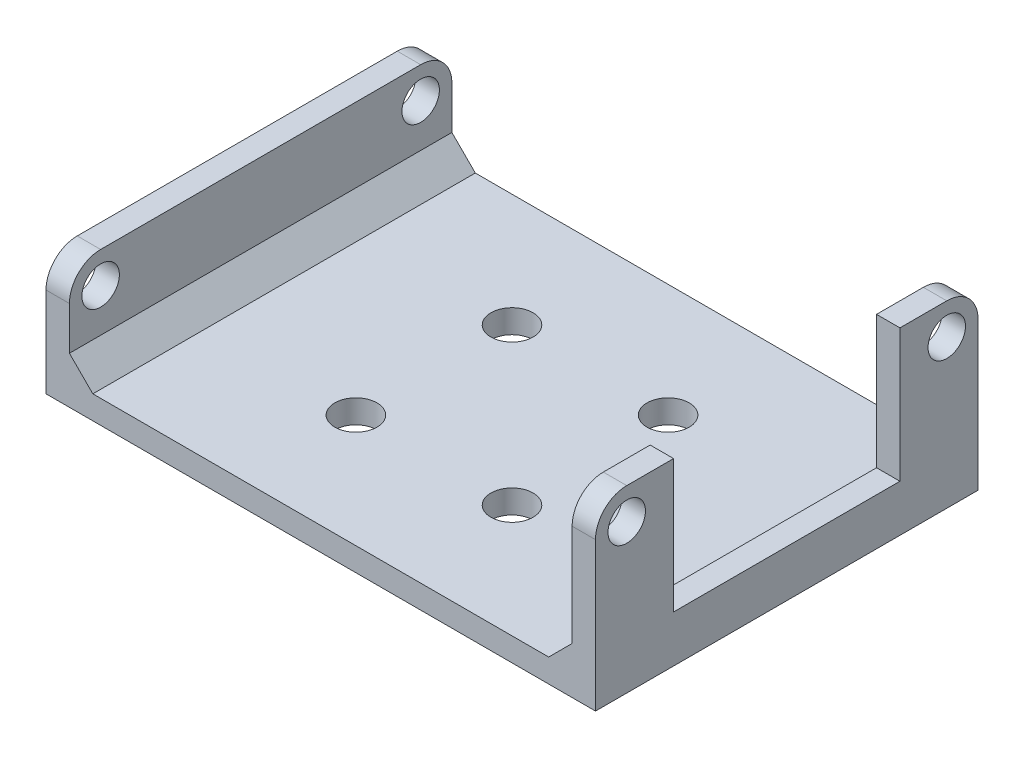
ISO-10303-21;
HEADER;
FILE_DESCRIPTION(('STEP AP214'),'2;1');
FILE_NAME('part.step','',(''),(''),'','','');
FILE_SCHEMA(('AUTOMOTIVE_DESIGN { 1 0 10303 214 1 1 1 1 }'));
ENDSEC;
DATA;
#1=APPLICATION_CONTEXT('core data for automotive mechanical design processes');
#2=APPLICATION_PROTOCOL_DEFINITION('international standard','automotive_design',2000,#1);
#3=PRODUCT_CONTEXT('',#1,'mechanical');
#4=PRODUCT('Part','Part','',(#3));
#5=PRODUCT_RELATED_PRODUCT_CATEGORY('part','',(#4));
#6=PRODUCT_DEFINITION_FORMATION('','',#4);
#7=PRODUCT_DEFINITION_CONTEXT('part definition',#1,'design');
#8=PRODUCT_DEFINITION('design','',#6,#7);
#9=PRODUCT_DEFINITION_SHAPE('','',#8);
#10=(LENGTH_UNIT() NAMED_UNIT(*) SI_UNIT(.MILLI.,.METRE.));
#11=(NAMED_UNIT(*) PLANE_ANGLE_UNIT() SI_UNIT($,.RADIAN.));
#12=(NAMED_UNIT(*) SI_UNIT($,.STERADIAN.) SOLID_ANGLE_UNIT());
#13=UNCERTAINTY_MEASURE_WITH_UNIT(LENGTH_MEASURE(1.E-05),#10,'distance_accuracy_value','');
#14=(GEOMETRIC_REPRESENTATION_CONTEXT(3) GLOBAL_UNCERTAINTY_ASSIGNED_CONTEXT((#13)) GLOBAL_UNIT_ASSIGNED_CONTEXT((#10,
#11,#12)) REPRESENTATION_CONTEXT('',''));
#15=CARTESIAN_POINT('',(0.,0.,0.));
#16=DIRECTION('',(0.,0.,1.));
#17=DIRECTION('',(1.,0.,0.));
#18=AXIS2_PLACEMENT_3D('',#15,#16,#17);
#19=CARTESIAN_POINT('',(16.1,0.,0.));
#20=DIRECTION('',(1.,0.,0.));
#21=DIRECTION('',(0.,0.,-1.));
#22=AXIS2_PLACEMENT_3D('',#19,#20,#21);
#23=PLANE('',#22);
#24=CARTESIAN_POINT('',(16.1,9.51,-10.25));
#25=DIRECTION('',(1.,0.,0.));
#26=DIRECTION('',(0.,0.,-1.));
#27=AXIS2_PLACEMENT_3D('',#24,#25,#26);
#28=CIRCLE('',#27,1.2);
#29=CARTESIAN_POINT('',(16.1,9.51,-11.45));
#30=VERTEX_POINT('',#29);
#31=EDGE_CURVE('E239',#30,#30,#28,.F.);
#32=ORIENTED_EDGE('',*,*,#31,.F.);
#33=EDGE_LOOP('',(#32));
#34=FACE_BOUND('',#33,.T.);
#35=DIRECTION('',(0.,-1.,0.));
#36=VECTOR('',#35,1.);
#37=CARTESIAN_POINT('',(16.1,0.,-12.25));
#38=LINE('',#37,#36);
#39=CARTESIAN_POINT('',(16.1,9.51,-12.25));
#40=VERTEX_POINT('',#39);
#41=CARTESIAN_POINT('',(16.1,3.,-12.25));
#42=VERTEX_POINT('',#41);
#43=EDGE_CURVE('E221',#40,#42,#38,.T.);
#44=ORIENTED_EDGE('',*,*,#43,.T.);
#45=DIRECTION('',(0.,0.,1.));
#46=VECTOR('',#45,1.);
#47=CARTESIAN_POINT('',(16.1,3.,0.));
#48=LINE('',#47,#46);
#49=CARTESIAN_POINT('',(16.1,3.,-7.25));
#50=VERTEX_POINT('',#49);
#51=EDGE_CURVE('E345',#42,#50,#48,.T.);
#52=ORIENTED_EDGE('',*,*,#51,.T.);
#53=DIRECTION('',(0.,1.,0.));
#54=VECTOR('',#53,1.);
#55=CARTESIAN_POINT('',(16.1,0.,-7.25));
#56=LINE('',#55,#54);
#57=CARTESIAN_POINT('',(16.1,11.51,-7.25));
#58=VERTEX_POINT('',#57);
#59=EDGE_CURVE('E230',#50,#58,#56,.T.);
#60=ORIENTED_EDGE('',*,*,#59,.T.);
#61=DIRECTION('',(0.,0.,-1.));
#62=VECTOR('',#61,1.);
#63=CARTESIAN_POINT('',(16.1,11.51,0.));
#64=LINE('',#63,#62);
#65=CARTESIAN_POINT('',(16.1,11.51,-10.25));
#66=VERTEX_POINT('',#65);
#67=EDGE_CURVE('E227',#58,#66,#64,.T.);
#68=ORIENTED_EDGE('',*,*,#67,.T.);
#69=CARTESIAN_POINT('',(16.1,9.51,-10.25));
#70=DIRECTION('',(1.,0.,0.));
#71=DIRECTION('',(0.,0.,-1.));
#72=AXIS2_PLACEMENT_3D('',#69,#70,#71);
#73=CIRCLE('',#72,2.);
#74=EDGE_CURVE('E224',#66,#40,#73,.F.);
#75=ORIENTED_EDGE('',*,*,#74,.T.);
#76=EDGE_LOOP('',(#44,#52,#60,#68,#75));
#77=FACE_BOUND('',#76,.T.);
#78=ADVANCED_FACE('F40',(#34,#77),#23,.F.);
#79=CARTESIAN_POINT('',(0.,1.5,0.));
#80=DIRECTION('',(0.,1.,0.));
#81=DIRECTION('',(0.,0.,1.));
#82=AXIS2_PLACEMENT_3D('',#79,#80,#81);
#83=PLANE('',#82);
#84=DIRECTION('',(1.,0.,0.));
#85=VECTOR('',#84,1.);
#86=CARTESIAN_POINT('',(17.6,1.5,12.25));
#87=LINE('',#86,#85);
#88=CARTESIAN_POINT('',(-14.6,1.5,12.25));
#89=VERTEX_POINT('',#88);
#90=CARTESIAN_POINT('',(14.6,1.5,12.25));
#91=VERTEX_POINT('',#90);
#92=EDGE_CURVE('E313',#89,#91,#87,.T.);
#93=ORIENTED_EDGE('',*,*,#92,.T.);
#94=DIRECTION('',(0.,0.,-1.));
#95=VECTOR('',#94,1.);
#96=CARTESIAN_POINT('',(14.6,1.5,0.));
#97=LINE('',#96,#95);
#98=CARTESIAN_POINT('',(14.6,1.5,-12.25));
#99=VERTEX_POINT('',#98);
#100=EDGE_CURVE('E340',#91,#99,#97,.T.);
#101=ORIENTED_EDGE('',*,*,#100,.T.);
#102=DIRECTION('',(-1.,0.,0.));
#103=VECTOR('',#102,1.);
#104=CARTESIAN_POINT('',(17.6,1.5,-12.25));
#105=LINE('',#104,#103);
#106=CARTESIAN_POINT('',(-14.6,1.5,-12.25));
#107=VERTEX_POINT('',#106);
#108=EDGE_CURVE('E316',#99,#107,#105,.T.);
#109=ORIENTED_EDGE('',*,*,#108,.T.);
#110=DIRECTION('',(0.,0.,1.));
#111=VECTOR('',#110,1.);
#112=CARTESIAN_POINT('',(-14.6,1.5,12.25));
#113=LINE('',#112,#111);
#114=EDGE_CURVE('E338',#107,#89,#113,.T.);
#115=ORIENTED_EDGE('',*,*,#114,.T.);
#116=EDGE_LOOP('',(#93,#101,#109,#115));
#117=FACE_BOUND('',#116,.T.);
#118=CARTESIAN_POINT('',(-5.,1.5,5.));
#119=DIRECTION('',(0.,1.,0.));
#120=DIRECTION('',(0.,0.,-1.));
#121=AXIS2_PLACEMENT_3D('',#118,#119,#120);
#122=CIRCLE('',#121,1.35);
#123=CARTESIAN_POINT('',(-5.,1.5,3.65));
#124=VERTEX_POINT('',#123);
#125=EDGE_CURVE('E295',#124,#124,#122,.T.);
#126=ORIENTED_EDGE('',*,*,#125,.F.);
#127=EDGE_LOOP('',(#126));
#128=FACE_BOUND('',#127,.T.);
#129=CARTESIAN_POINT('',(-5.,1.5,-5.));
#130=DIRECTION('',(0.,1.,0.));
#131=DIRECTION('',(0.,0.,1.));
#132=AXIS2_PLACEMENT_3D('',#129,#130,#131);
#133=CIRCLE('',#132,1.35);
#134=CARTESIAN_POINT('',(-5.,1.5,-3.65));
#135=VERTEX_POINT('',#134);
#136=EDGE_CURVE('E307',#135,#135,#133,.T.);
#137=ORIENTED_EDGE('',*,*,#136,.F.);
#138=EDGE_LOOP('',(#137));
#139=FACE_BOUND('',#138,.T.);
#140=CARTESIAN_POINT('',(5.,1.5,-5.));
#141=DIRECTION('',(0.,1.,0.));
#142=DIRECTION('',(0.,0.,-1.));
#143=AXIS2_PLACEMENT_3D('',#140,#141,#142);
#144=CIRCLE('',#143,1.35);
#145=CARTESIAN_POINT('',(5.,1.5,-6.35));
#146=VERTEX_POINT('',#145);
#147=EDGE_CURVE('E301',#146,#146,#144,.T.);
#148=ORIENTED_EDGE('',*,*,#147,.F.);
#149=EDGE_LOOP('',(#148));
#150=FACE_BOUND('',#149,.T.);
#151=CARTESIAN_POINT('',(5.,1.5,5.));
#152=DIRECTION('',(0.,1.,0.));
#153=DIRECTION('',(0.,0.,1.));
#154=AXIS2_PLACEMENT_3D('',#151,#152,#153);
#155=CIRCLE('',#154,1.35);
#156=CARTESIAN_POINT('',(5.,1.5,6.35));
#157=VERTEX_POINT('',#156);
#158=EDGE_CURVE('E289',#157,#157,#155,.T.);
#159=ORIENTED_EDGE('',*,*,#158,.F.);
#160=EDGE_LOOP('',(#159));
#161=FACE_BOUND('',#160,.T.);
#162=ADVANCED_FACE('F358',(#117,#128,#139,#150,#161),#83,.T.);
#163=CARTESIAN_POINT('',(0.,0.,0.));
#164=DIRECTION('',(0.,1.,0.));
#165=DIRECTION('',(0.,0.,1.));
#166=AXIS2_PLACEMENT_3D('',#163,#164,#165);
#167=PLANE('',#166);
#168=DIRECTION('',(0.,0.,-1.));
#169=VECTOR('',#168,1.);
#170=CARTESIAN_POINT('',(17.6,0.,12.25));
#171=LINE('',#170,#169);
#172=CARTESIAN_POINT('',(17.6,0.,12.25));
#173=VERTEX_POINT('',#172);
#174=CARTESIAN_POINT('',(17.6,0.,-12.25));
#175=VERTEX_POINT('',#174);
#176=EDGE_CURVE('E325',#173,#175,#171,.T.);
#177=ORIENTED_EDGE('',*,*,#176,.F.);
#178=DIRECTION('',(1.,0.,0.));
#179=VECTOR('',#178,1.);
#180=CARTESIAN_POINT('',(17.6,0.,12.25));
#181=LINE('',#180,#179);
#182=CARTESIAN_POINT('',(-17.6,0.,12.25));
#183=VERTEX_POINT('',#182);
#184=EDGE_CURVE('E323',#183,#173,#181,.T.);
#185=ORIENTED_EDGE('',*,*,#184,.F.);
#186=DIRECTION('',(0.,0.,1.));
#187=VECTOR('',#186,1.);
#188=CARTESIAN_POINT('',(-17.6,0.,12.25));
#189=LINE('',#188,#187);
#190=CARTESIAN_POINT('',(-17.6,0.,-12.25));
#191=VERTEX_POINT('',#190);
#192=EDGE_CURVE('E310',#191,#183,#189,.T.);
#193=ORIENTED_EDGE('',*,*,#192,.F.);
#194=DIRECTION('',(-1.,0.,0.));
#195=VECTOR('',#194,1.);
#196=CARTESIAN_POINT('',(17.6,0.,-12.25));
#197=LINE('',#196,#195);
#198=EDGE_CURVE('E317',#175,#191,#197,.T.);
#199=ORIENTED_EDGE('',*,*,#198,.F.);
#200=EDGE_LOOP('',(#177,#185,#193,#199));
#201=FACE_BOUND('',#200,.T.);
#202=CARTESIAN_POINT('',(5.,0.,5.));
#203=DIRECTION('',(0.,1.,0.));
#204=DIRECTION('',(0.,0.,1.));
#205=AXIS2_PLACEMENT_3D('',#202,#203,#204);
#206=CIRCLE('',#205,1.35);
#207=CARTESIAN_POINT('',(5.,0.,6.35));
#208=VERTEX_POINT('',#207);
#209=EDGE_CURVE('E270',#208,#208,#206,.T.);
#210=ORIENTED_EDGE('',*,*,#209,.T.);
#211=EDGE_LOOP('',(#210));
#212=FACE_BOUND('',#211,.T.);
#213=CARTESIAN_POINT('',(-5.,0.,5.));
#214=DIRECTION('',(0.,1.,0.));
#215=DIRECTION('',(0.,0.,-1.));
#216=AXIS2_PLACEMENT_3D('',#213,#214,#215);
#217=CIRCLE('',#216,1.35);
#218=CARTESIAN_POINT('',(-5.,0.,3.65));
#219=VERTEX_POINT('',#218);
#220=EDGE_CURVE('E292',#219,#219,#217,.T.);
#221=ORIENTED_EDGE('',*,*,#220,.T.);
#222=EDGE_LOOP('',(#221));
#223=FACE_BOUND('',#222,.T.);
#224=CARTESIAN_POINT('',(5.,0.,-5.));
#225=DIRECTION('',(0.,1.,0.));
#226=DIRECTION('',(0.,0.,-1.));
#227=AXIS2_PLACEMENT_3D('',#224,#225,#226);
#228=CIRCLE('',#227,1.35);
#229=CARTESIAN_POINT('',(5.,0.,-6.35));
#230=VERTEX_POINT('',#229);
#231=EDGE_CURVE('E298',#230,#230,#228,.T.);
#232=ORIENTED_EDGE('',*,*,#231,.T.);
#233=EDGE_LOOP('',(#232));
#234=FACE_BOUND('',#233,.T.);
#235=CARTESIAN_POINT('',(-5.,0.,-5.));
#236=DIRECTION('',(0.,1.,0.));
#237=DIRECTION('',(0.,0.,1.));
#238=AXIS2_PLACEMENT_3D('',#235,#236,#237);
#239=CIRCLE('',#238,1.35);
#240=CARTESIAN_POINT('',(-5.,0.,-3.65));
#241=VERTEX_POINT('',#240);
#242=EDGE_CURVE('E304',#241,#241,#239,.T.);
#243=ORIENTED_EDGE('',*,*,#242,.T.);
#244=EDGE_LOOP('',(#243));
#245=FACE_BOUND('',#244,.T.);
#246=ADVANCED_FACE('F378',(#201,#212,#223,#234,#245),#167,.F.);
#247=CARTESIAN_POINT('',(-17.6,1.5,12.25));
#248=DIRECTION('',(1.,0.,0.));
#249=DIRECTION('',(0.,0.,-1.));
#250=AXIS2_PLACEMENT_3D('',#247,#248,#249);
#251=PLANE('',#250);
#252=ORIENTED_EDGE('',*,*,#192,.T.);
#253=DIRECTION('',(0.,-1.,0.));
#254=VECTOR('',#253,1.);
#255=CARTESIAN_POINT('',(-17.6,1.5,12.25));
#256=LINE('',#255,#254);
#257=CARTESIAN_POINT('',(-17.6,5.76,12.25));
#258=VERTEX_POINT('',#257);
#259=EDGE_CURVE('E336',#258,#183,#256,.T.);
#260=ORIENTED_EDGE('',*,*,#259,.F.);
#261=CARTESIAN_POINT('',(-17.6,5.76,10.25));
#262=DIRECTION('',(-1.,0.,0.));
#263=DIRECTION('',(0.,0.,-1.));
#264=AXIS2_PLACEMENT_3D('',#261,#262,#263);
#265=CIRCLE('',#264,2.);
#266=CARTESIAN_POINT('',(-17.6,7.76,10.25));
#267=VERTEX_POINT('',#266);
#268=EDGE_CURVE('E178',#258,#267,#265,.T.);
#269=ORIENTED_EDGE('',*,*,#268,.T.);
#270=DIRECTION('',(0.,0.,-1.));
#271=VECTOR('',#270,1.);
#272=CARTESIAN_POINT('',(-17.6,7.76,10.25));
#273=LINE('',#272,#271);
#274=CARTESIAN_POINT('',(-17.6,7.76,-10.25));
#275=VERTEX_POINT('',#274);
#276=EDGE_CURVE('E194',#267,#275,#273,.T.);
#277=ORIENTED_EDGE('',*,*,#276,.T.);
#278=CARTESIAN_POINT('',(-17.6,5.76,-10.25));
#279=DIRECTION('',(-1.,0.,0.));
#280=DIRECTION('',(0.,0.,1.));
#281=AXIS2_PLACEMENT_3D('',#278,#279,#280);
#282=CIRCLE('',#281,2.);
#283=CARTESIAN_POINT('',(-17.6,5.76,-12.25));
#284=VERTEX_POINT('',#283);
#285=EDGE_CURVE('E198',#275,#284,#282,.T.);
#286=ORIENTED_EDGE('',*,*,#285,.T.);
#287=DIRECTION('',(0.,-1.,0.));
#288=VECTOR('',#287,1.);
#289=CARTESIAN_POINT('',(-17.6,1.5,-12.25));
#290=LINE('',#289,#288);
#291=EDGE_CURVE('E320',#284,#191,#290,.T.);
#292=ORIENTED_EDGE('',*,*,#291,.T.);
#293=EDGE_LOOP('',(#252,#260,#269,#277,#286,#292));
#294=FACE_BOUND('',#293,.T.);
#295=CARTESIAN_POINT('',(-17.6,5.76,10.25));
#296=DIRECTION('',(-1.,0.,0.));
#297=DIRECTION('',(0.,0.,-1.));
#298=AXIS2_PLACEMENT_3D('',#295,#296,#297);
#299=CIRCLE('',#298,1.2);
#300=CARTESIAN_POINT('',(-17.6,5.76,9.05));
#301=VERTEX_POINT('',#300);
#302=EDGE_CURVE('E769',#301,#301,#299,.T.);
#303=ORIENTED_EDGE('',*,*,#302,.F.);
#304=EDGE_LOOP('',(#303));
#305=FACE_BOUND('',#304,.T.);
#306=CARTESIAN_POINT('',(-17.6,5.76,-10.25));
#307=DIRECTION('',(-1.,0.,0.));
#308=DIRECTION('',(0.,0.,1.));
#309=AXIS2_PLACEMENT_3D('',#306,#307,#308);
#310=CIRCLE('',#309,1.2);
#311=CARTESIAN_POINT('',(-17.6,5.76,-9.05));
#312=VERTEX_POINT('',#311);
#313=EDGE_CURVE('E764',#312,#312,#310,.T.);
#314=ORIENTED_EDGE('',*,*,#313,.F.);
#315=EDGE_LOOP('',(#314));
#316=FACE_BOUND('',#315,.T.);
#317=ADVANCED_FACE('F368',(#294,#305,#316),#251,.F.);
#318=CARTESIAN_POINT('',(17.6,1.5,12.25));
#319=DIRECTION('',(0.,0.,-1.));
#320=DIRECTION('',(-1.,0.,0.));
#321=AXIS2_PLACEMENT_3D('',#318,#319,#320);
#322=PLANE('',#321);
#323=ORIENTED_EDGE('',*,*,#92,.F.);
#324=DIRECTION('',(0.707106781186544,-0.707106781186551,0.));
#325=VECTOR('',#324,1.);
#326=CARTESIAN_POINT('',(1.49999999999985,-14.6,12.25));
#327=LINE('',#326,#325);
#328=CARTESIAN_POINT('',(-16.1,3.00000000000001,12.25));
#329=VERTEX_POINT('',#328);
#330=EDGE_CURVE('E11',#89,#329,#327,.F.);
#331=ORIENTED_EDGE('',*,*,#330,.T.);
#332=DIRECTION('',(0.,1.,0.));
#333=VECTOR('',#332,1.);
#334=CARTESIAN_POINT('',(-16.1,5.76,12.25));
#335=LINE('',#334,#333);
#336=CARTESIAN_POINT('',(-16.1,5.76,12.25));
#337=VERTEX_POINT('',#336);
#338=EDGE_CURVE('E163',#329,#337,#335,.T.);
#339=ORIENTED_EDGE('',*,*,#338,.T.);
#340=DIRECTION('',(-1.,0.,0.));
#341=VECTOR('',#340,1.);
#342=CARTESIAN_POINT('',(-16.1,5.76,12.25));
#343=LINE('',#342,#341);
#344=EDGE_CURVE('E167',#337,#258,#343,.T.);
#345=ORIENTED_EDGE('',*,*,#344,.T.);
#346=ORIENTED_EDGE('',*,*,#259,.T.);
#347=ORIENTED_EDGE('',*,*,#184,.T.);
#348=DIRECTION('',(0.,-1.,0.));
#349=VECTOR('',#348,1.);
#350=CARTESIAN_POINT('',(17.6,1.5,12.25));
#351=LINE('',#350,#349);
#352=CARTESIAN_POINT('',(17.6,9.51,12.25));
#353=VERTEX_POINT('',#352);
#354=EDGE_CURVE('E333',#353,#173,#351,.T.);
#355=ORIENTED_EDGE('',*,*,#354,.F.);
#356=DIRECTION('',(1.,0.,0.));
#357=VECTOR('',#356,1.);
#358=CARTESIAN_POINT('',(16.1,9.51,12.25));
#359=LINE('',#358,#357);
#360=CARTESIAN_POINT('',(16.1,9.51,12.25));
#361=VERTEX_POINT('',#360);
#362=EDGE_CURVE('E285',#361,#353,#359,.T.);
#363=ORIENTED_EDGE('',*,*,#362,.F.);
#364=DIRECTION('',(0.,-1.,0.));
#365=VECTOR('',#364,1.);
#366=CARTESIAN_POINT('',(16.1,0.,12.25));
#367=LINE('',#366,#365);
#368=CARTESIAN_POINT('',(16.1,3.,12.25));
#369=VERTEX_POINT('',#368);
#370=EDGE_CURVE('E218',#361,#369,#367,.T.);
#371=ORIENTED_EDGE('',*,*,#370,.T.);
#372=DIRECTION('',(-0.707106781186551,-0.707106781186544,0.));
#373=VECTOR('',#372,1.);
#374=CARTESIAN_POINT('',(16.1,3.00000000000001,12.25));
#375=LINE('',#374,#373);
#376=EDGE_CURVE('E351',#369,#91,#375,.T.);
#377=ORIENTED_EDGE('',*,*,#376,.T.);
#378=EDGE_LOOP('',(#323,#331,#339,#345,#346,#347,#355,#363,#371,#377));
#379=FACE_BOUND('',#378,.T.);
#380=ADVANCED_FACE('F165',(#379),#322,.F.);
#381=CARTESIAN_POINT('',(17.6,1.5,12.25));
#382=DIRECTION('',(-1.,0.,0.));
#383=DIRECTION('',(0.,0.,1.));
#384=AXIS2_PLACEMENT_3D('',#381,#382,#383);
#385=PLANE('',#384);
#386=ORIENTED_EDGE('',*,*,#176,.T.);
#387=DIRECTION('',(0.,-1.,0.));
#388=VECTOR('',#387,1.);
#389=CARTESIAN_POINT('',(17.6,1.5,-12.25));
#390=LINE('',#389,#388);
#391=CARTESIAN_POINT('',(17.6,9.51,-12.25));
#392=VERTEX_POINT('',#391);
#393=EDGE_CURVE('E330',#392,#175,#390,.T.);
#394=ORIENTED_EDGE('',*,*,#393,.F.);
#395=CARTESIAN_POINT('',(17.6,9.51,-10.25));
#396=DIRECTION('',(1.,0.,0.));
#397=DIRECTION('',(0.,0.,-1.));
#398=AXIS2_PLACEMENT_3D('',#395,#396,#397);
#399=CIRCLE('',#398,2.);
#400=CARTESIAN_POINT('',(17.6,11.51,-10.25));
#401=VERTEX_POINT('',#400);
#402=EDGE_CURVE('E251',#401,#392,#399,.F.);
#403=ORIENTED_EDGE('',*,*,#402,.F.);
#404=DIRECTION('',(0.,0.,-1.));
#405=VECTOR('',#404,1.);
#406=CARTESIAN_POINT('',(17.6,11.51,0.));
#407=LINE('',#406,#405);
#408=CARTESIAN_POINT('',(17.6,11.51,-7.25));
#409=VERTEX_POINT('',#408);
#410=EDGE_CURVE('E254',#409,#401,#407,.T.);
#411=ORIENTED_EDGE('',*,*,#410,.F.);
#412=DIRECTION('',(0.,1.,0.));
#413=VECTOR('',#412,1.);
#414=CARTESIAN_POINT('',(17.6,0.,-7.25));
#415=LINE('',#414,#413);
#416=CARTESIAN_POINT('',(17.6,3.,-7.25));
#417=VERTEX_POINT('',#416);
#418=EDGE_CURVE('E257',#417,#409,#415,.T.);
#419=ORIENTED_EDGE('',*,*,#418,.F.);
#420=DIRECTION('',(0.,0.,-1.));
#421=VECTOR('',#420,1.);
#422=CARTESIAN_POINT('',(17.6,3.,0.));
#423=LINE('',#422,#421);
#424=CARTESIAN_POINT('',(17.6,3.,7.25));
#425=VERTEX_POINT('',#424);
#426=EDGE_CURVE('E260',#425,#417,#423,.T.);
#427=ORIENTED_EDGE('',*,*,#426,.F.);
#428=DIRECTION('',(0.,1.,0.));
#429=VECTOR('',#428,1.);
#430=CARTESIAN_POINT('',(17.6,0.,7.25));
#431=LINE('',#430,#429);
#432=CARTESIAN_POINT('',(17.6,11.51,7.25));
#433=VERTEX_POINT('',#432);
#434=EDGE_CURVE('E263',#425,#433,#431,.T.);
#435=ORIENTED_EDGE('',*,*,#434,.T.);
#436=DIRECTION('',(0.,0.,1.));
#437=VECTOR('',#436,1.);
#438=CARTESIAN_POINT('',(17.6,11.51,0.));
#439=LINE('',#438,#437);
#440=CARTESIAN_POINT('',(17.6,11.51,10.25));
#441=VERTEX_POINT('',#440);
#442=EDGE_CURVE('E245',#433,#441,#439,.T.);
#443=ORIENTED_EDGE('',*,*,#442,.T.);
#444=CARTESIAN_POINT('',(17.6,9.51,10.25));
#445=DIRECTION('',(1.,0.,0.));
#446=DIRECTION('',(0.,0.,-1.));
#447=AXIS2_PLACEMENT_3D('',#444,#445,#446);
#448=CIRCLE('',#447,2.);
#449=EDGE_CURVE('E248',#441,#353,#448,.T.);
#450=ORIENTED_EDGE('',*,*,#449,.T.);
#451=ORIENTED_EDGE('',*,*,#354,.T.);
#452=EDGE_LOOP('',(#386,#394,#403,#411,#419,#427,#435,#443,#450,#451));
#453=FACE_BOUND('',#452,.T.);
#454=CARTESIAN_POINT('',(17.6,9.51,10.25));
#455=DIRECTION('',(1.,0.,0.));
#456=DIRECTION('',(0.,0.,-1.));
#457=AXIS2_PLACEMENT_3D('',#454,#455,#456);
#458=CIRCLE('',#457,1.2);
#459=CARTESIAN_POINT('',(17.6,9.51,9.05));
#460=VERTEX_POINT('',#459);
#461=EDGE_CURVE('E204',#460,#460,#458,.T.);
#462=ORIENTED_EDGE('',*,*,#461,.F.);
#463=EDGE_LOOP('',(#462));
#464=FACE_BOUND('',#463,.T.);
#465=CARTESIAN_POINT('',(17.6,9.51,-10.25));
#466=DIRECTION('',(1.,0.,0.));
#467=DIRECTION('',(0.,0.,-1.));
#468=AXIS2_PLACEMENT_3D('',#465,#466,#467);
#469=CIRCLE('',#468,1.2);
#470=CARTESIAN_POINT('',(17.6,9.51,-11.45));
#471=VERTEX_POINT('',#470);
#472=EDGE_CURVE('E212',#471,#471,#469,.F.);
#473=ORIENTED_EDGE('',*,*,#472,.T.);
#474=EDGE_LOOP('',(#473));
#475=FACE_BOUND('',#474,.T.);
#476=ADVANCED_FACE('F374',(#453,#464,#475),#385,.F.);
#477=CARTESIAN_POINT('',(17.6,1.5,-12.25));
#478=DIRECTION('',(0.,0.,1.));
#479=DIRECTION('',(1.,0.,0.));
#480=AXIS2_PLACEMENT_3D('',#477,#478,#479);
#481=PLANE('',#480);
#482=ORIENTED_EDGE('',*,*,#198,.T.);
#483=ORIENTED_EDGE('',*,*,#291,.F.);
#484=DIRECTION('',(-1.,0.,0.));
#485=VECTOR('',#484,1.);
#486=CARTESIAN_POINT('',(-16.1,5.76,-12.25));
#487=LINE('',#486,#485);
#488=CARTESIAN_POINT('',(-16.1,5.76,-12.25));
#489=VERTEX_POINT('',#488);
#490=EDGE_CURVE('E201',#489,#284,#487,.T.);
#491=ORIENTED_EDGE('',*,*,#490,.F.);
#492=DIRECTION('',(0.,-1.,0.));
#493=VECTOR('',#492,1.);
#494=CARTESIAN_POINT('',(-16.1,5.76,-12.25));
#495=LINE('',#494,#493);
#496=CARTESIAN_POINT('',(-16.1,3.00000000000001,-12.25));
#497=VERTEX_POINT('',#496);
#498=EDGE_CURVE('E172',#489,#497,#495,.T.);
#499=ORIENTED_EDGE('',*,*,#498,.T.);
#500=DIRECTION('',(-0.707106781186544,0.707106781186551,0.));
#501=VECTOR('',#500,1.);
#502=CARTESIAN_POINT('',(1.49999999999985,-14.6,-12.25));
#503=LINE('',#502,#501);
#504=EDGE_CURVE('E49',#497,#107,#503,.F.);
#505=ORIENTED_EDGE('',*,*,#504,.T.);
#506=ORIENTED_EDGE('',*,*,#108,.F.);
#507=DIRECTION('',(0.707106781186551,0.707106781186544,0.));
#508=VECTOR('',#507,1.);
#509=CARTESIAN_POINT('',(16.1,3.00000000000001,-12.25));
#510=LINE('',#509,#508);
#511=EDGE_CURVE('E349',#99,#42,#510,.T.);
#512=ORIENTED_EDGE('',*,*,#511,.T.);
#513=ORIENTED_EDGE('',*,*,#43,.F.);
#514=DIRECTION('',(1.,0.,0.));
#515=VECTOR('',#514,1.);
#516=CARTESIAN_POINT('',(16.1,9.51,-12.25));
#517=LINE('',#516,#515);
#518=EDGE_CURVE('E282',#40,#392,#517,.T.);
#519=ORIENTED_EDGE('',*,*,#518,.T.);
#520=ORIENTED_EDGE('',*,*,#393,.T.);
#521=EDGE_LOOP('',(#482,#483,#491,#499,#505,#506,#512,#513,#519,#520));
#522=FACE_BOUND('',#521,.T.);
#523=ADVANCED_FACE('F355',(#522),#481,.F.);
#524=CARTESIAN_POINT('',(-5.,1.5,-5.));
#525=DIRECTION('',(0.,-1.,0.));
#526=DIRECTION('',(0.,0.,-1.));
#527=AXIS2_PLACEMENT_3D('',#524,#525,#526);
#528=CYLINDRICAL_SURFACE('',#527,1.35);
#529=ORIENTED_EDGE('',*,*,#136,.T.);
#530=EDGE_LOOP('',(#529));
#531=FACE_BOUND('',#530,.T.);
#532=ORIENTED_EDGE('',*,*,#242,.F.);
#533=EDGE_LOOP('',(#532));
#534=FACE_BOUND('',#533,.T.);
#535=ADVANCED_FACE('F461',(#531,#534),#528,.F.);
#536=CARTESIAN_POINT('',(5.,1.5,-5.));
#537=DIRECTION('',(0.,-1.,0.));
#538=DIRECTION('',(0.,0.,-1.));
#539=AXIS2_PLACEMENT_3D('',#536,#537,#538);
#540=CYLINDRICAL_SURFACE('',#539,1.35);
#541=ORIENTED_EDGE('',*,*,#147,.T.);
#542=EDGE_LOOP('',(#541));
#543=FACE_BOUND('',#542,.T.);
#544=ORIENTED_EDGE('',*,*,#231,.F.);
#545=EDGE_LOOP('',(#544));
#546=FACE_BOUND('',#545,.T.);
#547=ADVANCED_FACE('F632',(#543,#546),#540,.F.);
#548=CARTESIAN_POINT('',(-5.,1.5,5.));
#549=DIRECTION('',(0.,-1.,0.));
#550=DIRECTION('',(0.,0.,-1.));
#551=AXIS2_PLACEMENT_3D('',#548,#549,#550);
#552=CYLINDRICAL_SURFACE('',#551,1.35);
#553=ORIENTED_EDGE('',*,*,#125,.T.);
#554=EDGE_LOOP('',(#553));
#555=FACE_BOUND('',#554,.T.);
#556=ORIENTED_EDGE('',*,*,#220,.F.);
#557=EDGE_LOOP('',(#556));
#558=FACE_BOUND('',#557,.T.);
#559=ADVANCED_FACE('F623',(#555,#558),#552,.F.);
#560=CARTESIAN_POINT('',(5.,1.5,5.));
#561=DIRECTION('',(0.,-1.,0.));
#562=DIRECTION('',(0.,0.,-1.));
#563=AXIS2_PLACEMENT_3D('',#560,#561,#562);
#564=CYLINDRICAL_SURFACE('',#563,1.35);
#565=ORIENTED_EDGE('',*,*,#158,.T.);
#566=EDGE_LOOP('',(#565));
#567=FACE_BOUND('',#566,.T.);
#568=ORIENTED_EDGE('',*,*,#209,.F.);
#569=EDGE_LOOP('',(#568));
#570=FACE_BOUND('',#569,.T.);
#571=ADVANCED_FACE('F608',(#567,#570),#564,.F.);
#572=CARTESIAN_POINT('',(16.1,11.51,0.));
#573=DIRECTION('',(0.,1.,0.));
#574=DIRECTION('',(0.,0.,1.));
#575=AXIS2_PLACEMENT_3D('',#572,#573,#574);
#576=PLANE('',#575);
#577=ORIENTED_EDGE('',*,*,#442,.F.);
#578=DIRECTION('',(1.,0.,0.));
#579=VECTOR('',#578,1.);
#580=CARTESIAN_POINT('',(16.1,11.51,7.25));
#581=LINE('',#580,#579);
#582=CARTESIAN_POINT('',(16.1,11.51,7.25));
#583=VERTEX_POINT('',#582);
#584=EDGE_CURVE('E268',#583,#433,#581,.T.);
#585=ORIENTED_EDGE('',*,*,#584,.F.);
#586=DIRECTION('',(0.,0.,1.));
#587=VECTOR('',#586,1.);
#588=CARTESIAN_POINT('',(16.1,11.51,0.));
#589=LINE('',#588,#587);
#590=CARTESIAN_POINT('',(16.1,11.51,10.25));
#591=VERTEX_POINT('',#590);
#592=EDGE_CURVE('E211',#583,#591,#589,.T.);
#593=ORIENTED_EDGE('',*,*,#592,.T.);
#594=DIRECTION('',(1.,0.,0.));
#595=VECTOR('',#594,1.);
#596=CARTESIAN_POINT('',(16.1,11.51,10.25));
#597=LINE('',#596,#595);
#598=EDGE_CURVE('E242',#591,#441,#597,.T.);
#599=ORIENTED_EDGE('',*,*,#598,.T.);
#600=EDGE_LOOP('',(#577,#585,#593,#599));
#601=FACE_BOUND('',#600,.T.);
#602=ADVANCED_FACE('F401',(#601),#576,.T.);
#603=CARTESIAN_POINT('',(16.1,0.,7.25));
#604=DIRECTION('',(0.,0.,-1.));
#605=DIRECTION('',(-1.,0.,0.));
#606=AXIS2_PLACEMENT_3D('',#603,#604,#605);
#607=PLANE('',#606);
#608=ORIENTED_EDGE('',*,*,#434,.F.);
#609=DIRECTION('',(1.,0.,0.));
#610=VECTOR('',#609,1.);
#611=CARTESIAN_POINT('',(16.1,3.,7.25));
#612=LINE('',#611,#610);
#613=CARTESIAN_POINT('',(16.1,3.,7.25));
#614=VERTEX_POINT('',#613);
#615=EDGE_CURVE('E271',#614,#425,#612,.T.);
#616=ORIENTED_EDGE('',*,*,#615,.F.);
#617=DIRECTION('',(0.,1.,0.));
#618=VECTOR('',#617,1.);
#619=CARTESIAN_POINT('',(16.1,0.,7.25));
#620=LINE('',#619,#618);
#621=EDGE_CURVE('E236',#614,#583,#620,.T.);
#622=ORIENTED_EDGE('',*,*,#621,.T.);
#623=ORIENTED_EDGE('',*,*,#584,.T.);
#624=EDGE_LOOP('',(#608,#616,#622,#623));
#625=FACE_BOUND('',#624,.T.);
#626=ADVANCED_FACE('F395',(#625),#607,.T.);
#627=CARTESIAN_POINT('',(16.1,3.,0.));
#628=DIRECTION('',(0.,-1.,0.));
#629=DIRECTION('',(0.,0.,-1.));
#630=AXIS2_PLACEMENT_3D('',#627,#628,#629);
#631=PLANE('',#630);
#632=ORIENTED_EDGE('',*,*,#426,.T.);
#633=DIRECTION('',(1.,0.,0.));
#634=VECTOR('',#633,1.);
#635=CARTESIAN_POINT('',(16.1,3.,-7.25));
#636=LINE('',#635,#634);
#637=EDGE_CURVE('E273',#50,#417,#636,.T.);
#638=ORIENTED_EDGE('',*,*,#637,.F.);
#639=DIRECTION('',(0.,0.,-1.));
#640=VECTOR('',#639,1.);
#641=CARTESIAN_POINT('',(16.1,3.,0.));
#642=LINE('',#641,#640);
#643=EDGE_CURVE('E233',#614,#50,#642,.T.);
#644=ORIENTED_EDGE('',*,*,#643,.F.);
#645=ORIENTED_EDGE('',*,*,#615,.T.);
#646=EDGE_LOOP('',(#632,#638,#644,#645));
#647=FACE_BOUND('',#646,.T.);
#648=ADVANCED_FACE('F415',(#647),#631,.F.);
#649=CARTESIAN_POINT('',(16.1,0.,-7.25));
#650=DIRECTION('',(0.,0.,-1.));
#651=DIRECTION('',(-1.,0.,0.));
#652=AXIS2_PLACEMENT_3D('',#649,#650,#651);
#653=PLANE('',#652);
#654=ORIENTED_EDGE('',*,*,#418,.T.);
#655=DIRECTION('',(1.,0.,0.));
#656=VECTOR('',#655,1.);
#657=CARTESIAN_POINT('',(16.1,11.51,-7.25));
#658=LINE('',#657,#656);
#659=EDGE_CURVE('E276',#58,#409,#658,.T.);
#660=ORIENTED_EDGE('',*,*,#659,.F.);
#661=ORIENTED_EDGE('',*,*,#59,.F.);
#662=ORIENTED_EDGE('',*,*,#637,.T.);
#663=EDGE_LOOP('',(#654,#660,#661,#662));
#664=FACE_BOUND('',#663,.T.);
#665=ADVANCED_FACE('F389',(#664),#653,.F.);
#666=CARTESIAN_POINT('',(16.1,11.51,0.));
#667=DIRECTION('',(0.,-1.,0.));
#668=DIRECTION('',(0.,0.,-1.));
#669=AXIS2_PLACEMENT_3D('',#666,#667,#668);
#670=PLANE('',#669);
#671=ORIENTED_EDGE('',*,*,#410,.T.);
#672=DIRECTION('',(1.,0.,0.));
#673=VECTOR('',#672,1.);
#674=CARTESIAN_POINT('',(16.1,11.51,-10.25));
#675=LINE('',#674,#673);
#676=EDGE_CURVE('E279',#66,#401,#675,.T.);
#677=ORIENTED_EDGE('',*,*,#676,.F.);
#678=ORIENTED_EDGE('',*,*,#67,.F.);
#679=ORIENTED_EDGE('',*,*,#659,.T.);
#680=EDGE_LOOP('',(#671,#677,#678,#679));
#681=FACE_BOUND('',#680,.T.);
#682=ADVANCED_FACE('F385',(#681),#670,.F.);
#683=CARTESIAN_POINT('',(16.1,9.51,-10.25));
#684=DIRECTION('',(1.,0.,0.));
#685=DIRECTION('',(0.,0.,-1.));
#686=AXIS2_PLACEMENT_3D('',#683,#684,#685);
#687=CYLINDRICAL_SURFACE('',#686,2.);
#688=ORIENTED_EDGE('',*,*,#402,.T.);
#689=ORIENTED_EDGE('',*,*,#518,.F.);
#690=ORIENTED_EDGE('',*,*,#74,.F.);
#691=ORIENTED_EDGE('',*,*,#676,.T.);
#692=EDGE_LOOP('',(#688,#689,#690,#691));
#693=FACE_BOUND('',#692,.T.);
#694=ADVANCED_FACE('F383',(#693),#687,.T.);
#695=CARTESIAN_POINT('',(16.1,9.51,10.25));
#696=DIRECTION('',(1.,0.,0.));
#697=DIRECTION('',(0.,0.,-1.));
#698=AXIS2_PLACEMENT_3D('',#695,#696,#697);
#699=CYLINDRICAL_SURFACE('',#698,2.);
#700=ORIENTED_EDGE('',*,*,#449,.F.);
#701=ORIENTED_EDGE('',*,*,#598,.F.);
#702=CARTESIAN_POINT('',(16.1,9.51,10.25));
#703=DIRECTION('',(1.,0.,0.));
#704=DIRECTION('',(0.,0.,-1.));
#705=AXIS2_PLACEMENT_3D('',#702,#703,#704);
#706=CIRCLE('',#705,2.);
#707=EDGE_CURVE('E215',#591,#361,#706,.T.);
#708=ORIENTED_EDGE('',*,*,#707,.T.);
#709=ORIENTED_EDGE('',*,*,#362,.T.);
#710=EDGE_LOOP('',(#700,#701,#708,#709));
#711=FACE_BOUND('',#710,.T.);
#712=ADVANCED_FACE('F404',(#711),#699,.T.);
#713=CARTESIAN_POINT('',(16.1,9.51,10.25));
#714=DIRECTION('',(1.,0.,0.));
#715=DIRECTION('',(0.,0.,-1.));
#716=AXIS2_PLACEMENT_3D('',#713,#714,#715);
#717=CYLINDRICAL_SURFACE('',#716,1.2);
#718=CARTESIAN_POINT('',(16.1,9.51,10.25));
#719=DIRECTION('',(1.,0.,0.));
#720=DIRECTION('',(0.,0.,-1.));
#721=AXIS2_PLACEMENT_3D('',#718,#719,#720);
#722=CIRCLE('',#721,1.2);
#723=CARTESIAN_POINT('',(16.1,9.51,9.05));
#724=VERTEX_POINT('',#723);
#725=EDGE_CURVE('E208',#724,#724,#722,.T.);
#726=ORIENTED_EDGE('',*,*,#725,.F.);
#727=EDGE_LOOP('',(#726));
#728=FACE_BOUND('',#727,.T.);
#729=ORIENTED_EDGE('',*,*,#461,.T.);
#730=EDGE_LOOP('',(#729));
#731=FACE_BOUND('',#730,.T.);
#732=ADVANCED_FACE('F443',(#728,#731),#717,.F.);
#733=CARTESIAN_POINT('',(16.1,9.51,-10.25));
#734=DIRECTION('',(1.,0.,0.));
#735=DIRECTION('',(0.,0.,-1.));
#736=AXIS2_PLACEMENT_3D('',#733,#734,#735);
#737=CYLINDRICAL_SURFACE('',#736,1.2);
#738=ORIENTED_EDGE('',*,*,#31,.T.);
#739=EDGE_LOOP('',(#738));
#740=FACE_BOUND('',#739,.T.);
#741=ORIENTED_EDGE('',*,*,#472,.F.);
#742=EDGE_LOOP('',(#741));
#743=FACE_BOUND('',#742,.T.);
#744=ADVANCED_FACE('F436',(#740,#743),#737,.F.);
#745=ORIENTED_EDGE('',*,*,#621,.F.);
#746=DIRECTION('',(0.,0.,1.));
#747=VECTOR('',#746,1.);
#748=CARTESIAN_POINT('',(16.1,3.,0.));
#749=LINE('',#748,#747);
#750=EDGE_CURVE('E343',#614,#369,#749,.T.);
#751=ORIENTED_EDGE('',*,*,#750,.T.);
#752=ORIENTED_EDGE('',*,*,#370,.F.);
#753=ORIENTED_EDGE('',*,*,#707,.F.);
#754=ORIENTED_EDGE('',*,*,#592,.F.);
#755=EDGE_LOOP('',(#745,#751,#752,#753,#754));
#756=FACE_BOUND('',#755,.T.);
#757=ORIENTED_EDGE('',*,*,#725,.T.);
#758=EDGE_LOOP('',(#757));
#759=FACE_BOUND('',#758,.T.);
#760=ADVANCED_FACE('F408',(#756,#759),#23,.F.);
#761=CARTESIAN_POINT('',(-16.1,5.76,-10.25));
#762=DIRECTION('',(-1.,0.,0.));
#763=DIRECTION('',(0.,0.,1.));
#764=AXIS2_PLACEMENT_3D('',#761,#762,#763);
#765=CYLINDRICAL_SURFACE('',#764,2.);
#766=ORIENTED_EDGE('',*,*,#285,.F.);
#767=DIRECTION('',(-1.,0.,0.));
#768=VECTOR('',#767,1.);
#769=CARTESIAN_POINT('',(-16.1,7.76,-10.25));
#770=LINE('',#769,#768);
#771=CARTESIAN_POINT('',(-16.1,7.76,-10.25));
#772=VERTEX_POINT('',#771);
#773=EDGE_CURVE('E205',#772,#275,#770,.T.);
#774=ORIENTED_EDGE('',*,*,#773,.F.);
#775=CARTESIAN_POINT('',(-16.1,5.76,-10.25));
#776=DIRECTION('',(-1.,0.,0.));
#777=DIRECTION('',(0.,0.,1.));
#778=AXIS2_PLACEMENT_3D('',#775,#776,#777);
#779=CIRCLE('',#778,2.);
#780=EDGE_CURVE('E180',#772,#489,#779,.T.);
#781=ORIENTED_EDGE('',*,*,#780,.T.);
#782=ORIENTED_EDGE('',*,*,#490,.T.);
#783=EDGE_LOOP('',(#766,#774,#781,#782));
#784=FACE_BOUND('',#783,.T.);
#785=ADVANCED_FACE('F363',(#784),#765,.T.);
#786=CARTESIAN_POINT('',(-16.1,7.76,10.25));
#787=DIRECTION('',(0.,1.,0.));
#788=DIRECTION('',(0.,0.,1.));
#789=AXIS2_PLACEMENT_3D('',#786,#787,#788);
#790=PLANE('',#789);
#791=ORIENTED_EDGE('',*,*,#276,.F.);
#792=DIRECTION('',(-1.,0.,0.));
#793=VECTOR('',#792,1.);
#794=CARTESIAN_POINT('',(-16.1,7.76,10.25));
#795=LINE('',#794,#793);
#796=CARTESIAN_POINT('',(-16.1,7.76,10.25));
#797=VERTEX_POINT('',#796);
#798=EDGE_CURVE('E179',#797,#267,#795,.T.);
#799=ORIENTED_EDGE('',*,*,#798,.F.);
#800=DIRECTION('',(0.,0.,-1.));
#801=VECTOR('',#800,1.);
#802=CARTESIAN_POINT('',(-16.1,7.76,10.25));
#803=LINE('',#802,#801);
#804=EDGE_CURVE('E186',#797,#772,#803,.T.);
#805=ORIENTED_EDGE('',*,*,#804,.T.);
#806=ORIENTED_EDGE('',*,*,#773,.T.);
#807=EDGE_LOOP('',(#791,#799,#805,#806));
#808=FACE_BOUND('',#807,.T.);
#809=ADVANCED_FACE('F366',(#808),#790,.T.);
#810=CARTESIAN_POINT('',(-16.1,5.76,10.25));
#811=DIRECTION('',(-1.,0.,0.));
#812=DIRECTION('',(0.,0.,1.));
#813=AXIS2_PLACEMENT_3D('',#810,#811,#812);
#814=CYLINDRICAL_SURFACE('',#813,2.);
#815=ORIENTED_EDGE('',*,*,#268,.F.);
#816=ORIENTED_EDGE('',*,*,#344,.F.);
#817=CARTESIAN_POINT('',(-16.1,5.76,10.25));
#818=DIRECTION('',(-1.,0.,0.));
#819=DIRECTION('',(0.,0.,-1.));
#820=AXIS2_PLACEMENT_3D('',#817,#818,#819);
#821=CIRCLE('',#820,2.);
#822=EDGE_CURVE('E171',#337,#797,#821,.T.);
#823=ORIENTED_EDGE('',*,*,#822,.T.);
#824=ORIENTED_EDGE('',*,*,#798,.T.);
#825=EDGE_LOOP('',(#815,#816,#823,#824));
#826=FACE_BOUND('',#825,.T.);
#827=ADVANCED_FACE('F176',(#826),#814,.T.);
#828=CARTESIAN_POINT('',(-16.1,5.76,10.25));
#829=DIRECTION('',(1.,0.,0.));
#830=DIRECTION('',(0.,0.,-1.));
#831=AXIS2_PLACEMENT_3D('',#828,#829,#830);
#832=PLANE('',#831);
#833=CARTESIAN_POINT('',(-16.1,5.76,10.25));
#834=DIRECTION('',(-1.,0.,0.));
#835=DIRECTION('',(0.,0.,-1.));
#836=AXIS2_PLACEMENT_3D('',#833,#834,#835);
#837=CIRCLE('',#836,1.2);
#838=CARTESIAN_POINT('',(-16.1,5.76,9.05));
#839=VERTEX_POINT('',#838);
#840=EDGE_CURVE('E761',#839,#839,#837,.T.);
#841=ORIENTED_EDGE('',*,*,#840,.T.);
#842=EDGE_LOOP('',(#841));
#843=FACE_BOUND('',#842,.T.);
#844=CARTESIAN_POINT('',(-16.1,5.76,-10.25));
#845=DIRECTION('',(-1.,0.,0.));
#846=DIRECTION('',(0.,0.,1.));
#847=AXIS2_PLACEMENT_3D('',#844,#845,#846);
#848=CIRCLE('',#847,1.2);
#849=CARTESIAN_POINT('',(-16.1,5.76,-9.05));
#850=VERTEX_POINT('',#849);
#851=EDGE_CURVE('E195',#850,#850,#848,.T.);
#852=ORIENTED_EDGE('',*,*,#851,.T.);
#853=EDGE_LOOP('',(#852));
#854=FACE_BOUND('',#853,.T.);
#855=ORIENTED_EDGE('',*,*,#338,.F.);
#856=DIRECTION('',(0.,0.,-1.));
#857=VECTOR('',#856,1.);
#858=CARTESIAN_POINT('',(-16.1,3.00000000000001,-12.25));
#859=LINE('',#858,#857);
#860=EDGE_CURVE('E347',#329,#497,#859,.T.);
#861=ORIENTED_EDGE('',*,*,#860,.T.);
#862=ORIENTED_EDGE('',*,*,#498,.F.);
#863=ORIENTED_EDGE('',*,*,#780,.F.);
#864=ORIENTED_EDGE('',*,*,#804,.F.);
#865=ORIENTED_EDGE('',*,*,#822,.F.);
#866=EDGE_LOOP('',(#855,#861,#862,#863,#864,#865));
#867=FACE_BOUND('',#866,.T.);
#868=ADVANCED_FACE('F183',(#843,#854,#867),#832,.T.);
#869=CARTESIAN_POINT('',(-16.1,5.76,-10.25));
#870=DIRECTION('',(-1.,0.,0.));
#871=DIRECTION('',(0.,0.,1.));
#872=AXIS2_PLACEMENT_3D('',#869,#870,#871);
#873=CYLINDRICAL_SURFACE('',#872,1.2);
#874=ORIENTED_EDGE('',*,*,#851,.F.);
#875=EDGE_LOOP('',(#874));
#876=FACE_BOUND('',#875,.T.);
#877=ORIENTED_EDGE('',*,*,#313,.T.);
#878=EDGE_LOOP('',(#877));
#879=FACE_BOUND('',#878,.T.);
#880=ADVANCED_FACE('F476',(#876,#879),#873,.F.);
#881=CARTESIAN_POINT('',(-16.1,5.76,10.25));
#882=DIRECTION('',(-1.,0.,0.));
#883=DIRECTION('',(0.,0.,1.));
#884=AXIS2_PLACEMENT_3D('',#881,#882,#883);
#885=CYLINDRICAL_SURFACE('',#884,1.2);
#886=ORIENTED_EDGE('',*,*,#840,.F.);
#887=EDGE_LOOP('',(#886));
#888=FACE_BOUND('',#887,.T.);
#889=ORIENTED_EDGE('',*,*,#302,.T.);
#890=EDGE_LOOP('',(#889));
#891=FACE_BOUND('',#890,.T.);
#892=ADVANCED_FACE('F472',(#888,#891),#885,.F.);
#893=CARTESIAN_POINT('',(14.6,1.5,0.));
#894=DIRECTION('',(0.707106781186544,-0.707106781186551,0.));
#895=DIRECTION('',(0.,0.,-1.));
#896=AXIS2_PLACEMENT_3D('',#893,#894,#895);
#897=PLANE('',#896);
#898=ORIENTED_EDGE('',*,*,#643,.T.);
#899=ORIENTED_EDGE('',*,*,#51,.F.);
#900=ORIENTED_EDGE('',*,*,#511,.F.);
#901=ORIENTED_EDGE('',*,*,#100,.F.);
#902=ORIENTED_EDGE('',*,*,#376,.F.);
#903=ORIENTED_EDGE('',*,*,#750,.F.);
#904=EDGE_LOOP('',(#898,#899,#900,#901,#902,#903));
#905=FACE_BOUND('',#904,.T.);
#906=ADVANCED_FACE('F412',(#905),#897,.F.);
#907=CARTESIAN_POINT('',(-16.1,3.00000000000001,10.25));
#908=DIRECTION('',(0.707106781186551,0.707106781186544,0.));
#909=DIRECTION('',(0.,0.,1.));
#910=AXIS2_PLACEMENT_3D('',#907,#908,#909);
#911=PLANE('',#910);
#912=ORIENTED_EDGE('',*,*,#330,.F.);
#913=ORIENTED_EDGE('',*,*,#114,.F.);
#914=ORIENTED_EDGE('',*,*,#504,.F.);
#915=ORIENTED_EDGE('',*,*,#860,.F.);
#916=EDGE_LOOP('',(#912,#913,#914,#915));
#917=FACE_BOUND('',#916,.T.);
#918=ADVANCED_FACE('F43',(#917),#911,.T.);
#919=CLOSED_SHELL('',(#78,#162,#246,#317,#380,#476,#523,#535,#547,#559,#571,#602,#626,#648,#665,
#682,#694,#712,#732,#744,#760,#785,#809,#827,#868,#880,#892,#906,#918));
#920=MANIFOLD_SOLID_BREP('B2',#919);
#921=ADVANCED_BREP_SHAPE_REPRESENTATION('',(#18,#920),#14);
#922=SHAPE_DEFINITION_REPRESENTATION(#9,#921);
ENDSEC;
END-ISO-10303-21;
